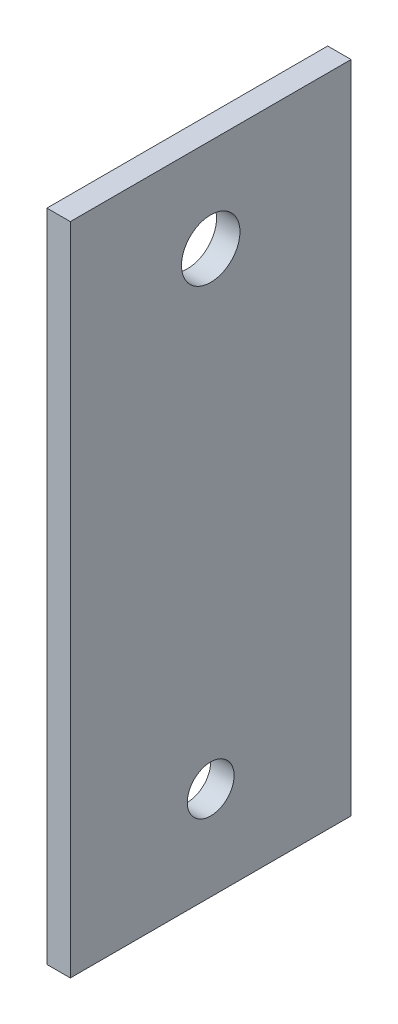
ISO-10303-21;
HEADER;
FILE_DESCRIPTION(('STEP AP214'),'2;1');
FILE_NAME('part.step','',(''),(''),'','','');
FILE_SCHEMA(('AUTOMOTIVE_DESIGN { 1 0 10303 214 1 1 1 1 }'));
ENDSEC;
DATA;
#1=APPLICATION_CONTEXT('core data for automotive mechanical design processes');
#2=APPLICATION_PROTOCOL_DEFINITION('international standard','automotive_design',2000,#1);
#3=PRODUCT_CONTEXT('',#1,'mechanical');
#4=PRODUCT('Part','Part','',(#3));
#5=PRODUCT_RELATED_PRODUCT_CATEGORY('part','',(#4));
#6=PRODUCT_DEFINITION_FORMATION('','',#4);
#7=PRODUCT_DEFINITION_CONTEXT('part definition',#1,'design');
#8=PRODUCT_DEFINITION('design','',#6,#7);
#9=PRODUCT_DEFINITION_SHAPE('','',#8);
#10=(LENGTH_UNIT() NAMED_UNIT(*) SI_UNIT(.MILLI.,.METRE.));
#11=(NAMED_UNIT(*) PLANE_ANGLE_UNIT() SI_UNIT($,.RADIAN.));
#12=(NAMED_UNIT(*) SI_UNIT($,.STERADIAN.) SOLID_ANGLE_UNIT());
#13=UNCERTAINTY_MEASURE_WITH_UNIT(LENGTH_MEASURE(1.E-05),#10,'distance_accuracy_value','');
#14=(GEOMETRIC_REPRESENTATION_CONTEXT(3) GLOBAL_UNCERTAINTY_ASSIGNED_CONTEXT((#13)) GLOBAL_UNIT_ASSIGNED_CONTEXT((#10,
#11,#12)) REPRESENTATION_CONTEXT('',''));
#15=CARTESIAN_POINT('',(0.,0.,0.));
#16=DIRECTION('',(0.,0.,1.));
#17=DIRECTION('',(1.,0.,0.));
#18=AXIS2_PLACEMENT_3D('',#15,#16,#17);
#19=CARTESIAN_POINT('',(3.175,0.,0.));
#20=DIRECTION('',(-1.,0.,0.));
#21=DIRECTION('',(0.,0.,1.));
#22=AXIS2_PLACEMENT_3D('',#19,#20,#21);
#23=PLANE('',#22);
#24=DIRECTION('',(0.,1.,0.));
#25=VECTOR('',#24,1.);
#26=CARTESIAN_POINT('',(3.175,-44.45,-19.05));
#27=LINE('',#26,#25);
#28=CARTESIAN_POINT('',(3.175,-44.45,-19.05));
#29=VERTEX_POINT('',#28);
#30=CARTESIAN_POINT('',(3.175,44.45,-19.05));
#31=VERTEX_POINT('',#30);
#32=EDGE_CURVE('E85',#29,#31,#27,.T.);
#33=ORIENTED_EDGE('',*,*,#32,.T.);
#34=DIRECTION('',(0.,0.,1.));
#35=VECTOR('',#34,1.);
#36=CARTESIAN_POINT('',(3.175,44.45,19.05));
#37=LINE('',#36,#35);
#38=CARTESIAN_POINT('',(3.175,44.45,19.05));
#39=VERTEX_POINT('',#38);
#40=EDGE_CURVE('E80',#31,#39,#37,.T.);
#41=ORIENTED_EDGE('',*,*,#40,.T.);
#42=DIRECTION('',(0.,-1.,0.));
#43=VECTOR('',#42,1.);
#44=CARTESIAN_POINT('',(3.175,-44.45,19.05));
#45=LINE('',#44,#43);
#46=CARTESIAN_POINT('',(3.175,-44.45,19.05));
#47=VERTEX_POINT('',#46);
#48=EDGE_CURVE('E83',#39,#47,#45,.T.);
#49=ORIENTED_EDGE('',*,*,#48,.T.);
#50=DIRECTION('',(0.,0.,-1.));
#51=VECTOR('',#50,1.);
#52=CARTESIAN_POINT('',(3.175,-44.45,19.05));
#53=LINE('',#52,#51);
#54=EDGE_CURVE('E50',#47,#29,#53,.T.);
#55=ORIENTED_EDGE('',*,*,#54,.T.);
#56=EDGE_LOOP('',(#33,#41,#49,#55));
#57=FACE_BOUND('',#56,.T.);
#58=CARTESIAN_POINT('',(3.175,31.75,0.));
#59=DIRECTION('',(1.,0.,0.));
#60=DIRECTION('',(0.,0.,-1.));
#61=AXIS2_PLACEMENT_3D('',#58,#59,#60);
#62=CIRCLE('',#61,3.96875);
#63=CARTESIAN_POINT('',(3.175,31.75,-3.96875));
#64=VERTEX_POINT('',#63);
#65=EDGE_CURVE('E100',#64,#64,#62,.T.);
#66=ORIENTED_EDGE('',*,*,#65,.F.);
#67=EDGE_LOOP('',(#66));
#68=FACE_BOUND('',#67,.T.);
#69=CARTESIAN_POINT('',(3.175,-31.75,0.));
#70=DIRECTION('',(1.,0.,0.));
#71=DIRECTION('',(0.,0.,-1.));
#72=AXIS2_PLACEMENT_3D('',#69,#70,#71);
#73=CIRCLE('',#72,3.175);
#74=CARTESIAN_POINT('',(3.175,-31.75,-3.17500000000001));
#75=VERTEX_POINT('',#74);
#76=EDGE_CURVE('E115',#75,#75,#73,.T.);
#77=ORIENTED_EDGE('',*,*,#76,.F.);
#78=EDGE_LOOP('',(#77));
#79=FACE_BOUND('',#78,.T.);
#80=ADVANCED_FACE('F33',(#57,#68,#79),#23,.F.);
#81=CARTESIAN_POINT('',(0.,0.,0.));
#82=DIRECTION('',(-1.,0.,0.));
#83=DIRECTION('',(0.,0.,1.));
#84=AXIS2_PLACEMENT_3D('',#81,#82,#83);
#85=PLANE('',#84);
#86=CARTESIAN_POINT('',(0.,31.75,0.));
#87=DIRECTION('',(1.,0.,0.));
#88=DIRECTION('',(0.,0.,-1.));
#89=AXIS2_PLACEMENT_3D('',#86,#87,#88);
#90=CIRCLE('',#89,3.96875);
#91=CARTESIAN_POINT('',(0.,31.75,-3.96875));
#92=VERTEX_POINT('',#91);
#93=EDGE_CURVE('E112',#92,#92,#90,.T.);
#94=ORIENTED_EDGE('',*,*,#93,.T.);
#95=EDGE_LOOP('',(#94));
#96=FACE_BOUND('',#95,.T.);
#97=DIRECTION('',(0.,1.,0.));
#98=VECTOR('',#97,1.);
#99=CARTESIAN_POINT('',(0.,-44.45,-19.05));
#100=LINE('',#99,#98);
#101=CARTESIAN_POINT('',(0.,-44.45,-19.05));
#102=VERTEX_POINT('',#101);
#103=CARTESIAN_POINT('',(0.,44.45,-19.05));
#104=VERTEX_POINT('',#103);
#105=EDGE_CURVE('E97',#102,#104,#100,.T.);
#106=ORIENTED_EDGE('',*,*,#105,.F.);
#107=DIRECTION('',(0.,0.,-1.));
#108=VECTOR('',#107,1.);
#109=CARTESIAN_POINT('',(0.,-44.45,19.05));
#110=LINE('',#109,#108);
#111=CARTESIAN_POINT('',(0.,-44.45,19.05));
#112=VERTEX_POINT('',#111);
#113=EDGE_CURVE('E73',#112,#102,#110,.T.);
#114=ORIENTED_EDGE('',*,*,#113,.F.);
#115=DIRECTION('',(0.,-1.,0.));
#116=VECTOR('',#115,1.);
#117=CARTESIAN_POINT('',(0.,-44.45,19.05));
#118=LINE('',#117,#116);
#119=CARTESIAN_POINT('',(0.,44.45,19.05));
#120=VERTEX_POINT('',#119);
#121=EDGE_CURVE('E67',#120,#112,#118,.T.);
#122=ORIENTED_EDGE('',*,*,#121,.F.);
#123=DIRECTION('',(0.,0.,1.));
#124=VECTOR('',#123,1.);
#125=CARTESIAN_POINT('',(0.,44.45,19.05));
#126=LINE('',#125,#124);
#127=EDGE_CURVE('E89',#104,#120,#126,.T.);
#128=ORIENTED_EDGE('',*,*,#127,.F.);
#129=EDGE_LOOP('',(#106,#114,#122,#128));
#130=FACE_BOUND('',#129,.T.);
#131=CARTESIAN_POINT('',(0.,-31.75,0.));
#132=DIRECTION('',(1.,0.,0.));
#133=DIRECTION('',(0.,0.,-1.));
#134=AXIS2_PLACEMENT_3D('',#131,#132,#133);
#135=CIRCLE('',#134,3.175);
#136=CARTESIAN_POINT('',(0.,-31.75,-3.17500000000001));
#137=VERTEX_POINT('',#136);
#138=EDGE_CURVE('E118',#137,#137,#135,.T.);
#139=ORIENTED_EDGE('',*,*,#138,.T.);
#140=EDGE_LOOP('',(#139));
#141=FACE_BOUND('',#140,.T.);
#142=ADVANCED_FACE('F108',(#96,#130,#141),#85,.T.);
#143=CARTESIAN_POINT('',(3.175,-44.45,-19.05));
#144=DIRECTION('',(0.,0.,1.));
#145=DIRECTION('',(1.,0.,0.));
#146=AXIS2_PLACEMENT_3D('',#143,#144,#145);
#147=PLANE('',#146);
#148=ORIENTED_EDGE('',*,*,#105,.T.);
#149=DIRECTION('',(-1.,0.,0.));
#150=VECTOR('',#149,1.);
#151=CARTESIAN_POINT('',(3.175,44.45,-19.05));
#152=LINE('',#151,#150);
#153=EDGE_CURVE('E11',#31,#104,#152,.T.);
#154=ORIENTED_EDGE('',*,*,#153,.F.);
#155=ORIENTED_EDGE('',*,*,#32,.F.);
#156=DIRECTION('',(-1.,0.,0.));
#157=VECTOR('',#156,1.);
#158=CARTESIAN_POINT('',(3.175,-44.45,-19.05));
#159=LINE('',#158,#157);
#160=EDGE_CURVE('E93',#29,#102,#159,.T.);
#161=ORIENTED_EDGE('',*,*,#160,.T.);
#162=EDGE_LOOP('',(#148,#154,#155,#161));
#163=FACE_BOUND('',#162,.T.);
#164=ADVANCED_FACE('F35',(#163),#147,.F.);
#165=CARTESIAN_POINT('',(3.175,44.45,19.05));
#166=DIRECTION('',(0.,-1.,0.));
#167=DIRECTION('',(0.,0.,-1.));
#168=AXIS2_PLACEMENT_3D('',#165,#166,#167);
#169=PLANE('',#168);
#170=ORIENTED_EDGE('',*,*,#127,.T.);
#171=DIRECTION('',(-1.,0.,0.));
#172=VECTOR('',#171,1.);
#173=CARTESIAN_POINT('',(3.175,44.45,19.05));
#174=LINE('',#173,#172);
#175=EDGE_CURVE('E42',#39,#120,#174,.T.);
#176=ORIENTED_EDGE('',*,*,#175,.F.);
#177=ORIENTED_EDGE('',*,*,#40,.F.);
#178=ORIENTED_EDGE('',*,*,#153,.T.);
#179=EDGE_LOOP('',(#170,#176,#177,#178));
#180=FACE_BOUND('',#179,.T.);
#181=ADVANCED_FACE('F88',(#180),#169,.F.);
#182=CARTESIAN_POINT('',(3.175,-44.45,19.05));
#183=DIRECTION('',(0.,0.,-1.));
#184=DIRECTION('',(0.,1.,0.));
#185=AXIS2_PLACEMENT_3D('',#182,#183,#184);
#186=PLANE('',#185);
#187=ORIENTED_EDGE('',*,*,#121,.T.);
#188=DIRECTION('',(-1.,0.,0.));
#189=VECTOR('',#188,1.);
#190=CARTESIAN_POINT('',(3.175,-44.45,19.05));
#191=LINE('',#190,#189);
#192=EDGE_CURVE('E90',#47,#112,#191,.T.);
#193=ORIENTED_EDGE('',*,*,#192,.F.);
#194=ORIENTED_EDGE('',*,*,#48,.F.);
#195=ORIENTED_EDGE('',*,*,#175,.T.);
#196=EDGE_LOOP('',(#187,#193,#194,#195));
#197=FACE_BOUND('',#196,.T.);
#198=ADVANCED_FACE('F91',(#197),#186,.F.);
#199=CARTESIAN_POINT('',(3.175,-44.45,19.05));
#200=DIRECTION('',(0.,1.,0.));
#201=DIRECTION('',(0.,0.,1.));
#202=AXIS2_PLACEMENT_3D('',#199,#200,#201);
#203=PLANE('',#202);
#204=ORIENTED_EDGE('',*,*,#113,.T.);
#205=ORIENTED_EDGE('',*,*,#160,.F.);
#206=ORIENTED_EDGE('',*,*,#54,.F.);
#207=ORIENTED_EDGE('',*,*,#192,.T.);
#208=EDGE_LOOP('',(#204,#205,#206,#207));
#209=FACE_BOUND('',#208,.T.);
#210=ADVANCED_FACE('F105',(#209),#203,.F.);
#211=CARTESIAN_POINT('',(3.175,31.75,0.));
#212=DIRECTION('',(-1.,0.,0.));
#213=DIRECTION('',(0.,0.,1.));
#214=AXIS2_PLACEMENT_3D('',#211,#212,#213);
#215=CYLINDRICAL_SURFACE('',#214,3.96875);
#216=ORIENTED_EDGE('',*,*,#65,.T.);
#217=EDGE_LOOP('',(#216));
#218=FACE_BOUND('',#217,.T.);
#219=ORIENTED_EDGE('',*,*,#93,.F.);
#220=EDGE_LOOP('',(#219));
#221=FACE_BOUND('',#220,.T.);
#222=ADVANCED_FACE('F135',(#218,#221),#215,.F.);
#223=CARTESIAN_POINT('',(3.175,-31.75,0.));
#224=DIRECTION('',(-1.,0.,0.));
#225=DIRECTION('',(0.,0.,1.));
#226=AXIS2_PLACEMENT_3D('',#223,#224,#225);
#227=CYLINDRICAL_SURFACE('',#226,3.175);
#228=ORIENTED_EDGE('',*,*,#76,.T.);
#229=EDGE_LOOP('',(#228));
#230=FACE_BOUND('',#229,.T.);
#231=ORIENTED_EDGE('',*,*,#138,.F.);
#232=EDGE_LOOP('',(#231));
#233=FACE_BOUND('',#232,.T.);
#234=ADVANCED_FACE('F124',(#230,#233),#227,.F.);
#235=CLOSED_SHELL('',(#80,#142,#164,#181,#198,#210,#222,#234));
#236=MANIFOLD_SOLID_BREP('B2',#235);
#237=ADVANCED_BREP_SHAPE_REPRESENTATION('',(#18,#236),#14);
#238=SHAPE_DEFINITION_REPRESENTATION(#9,#237);
ENDSEC;
END-ISO-10303-21;
